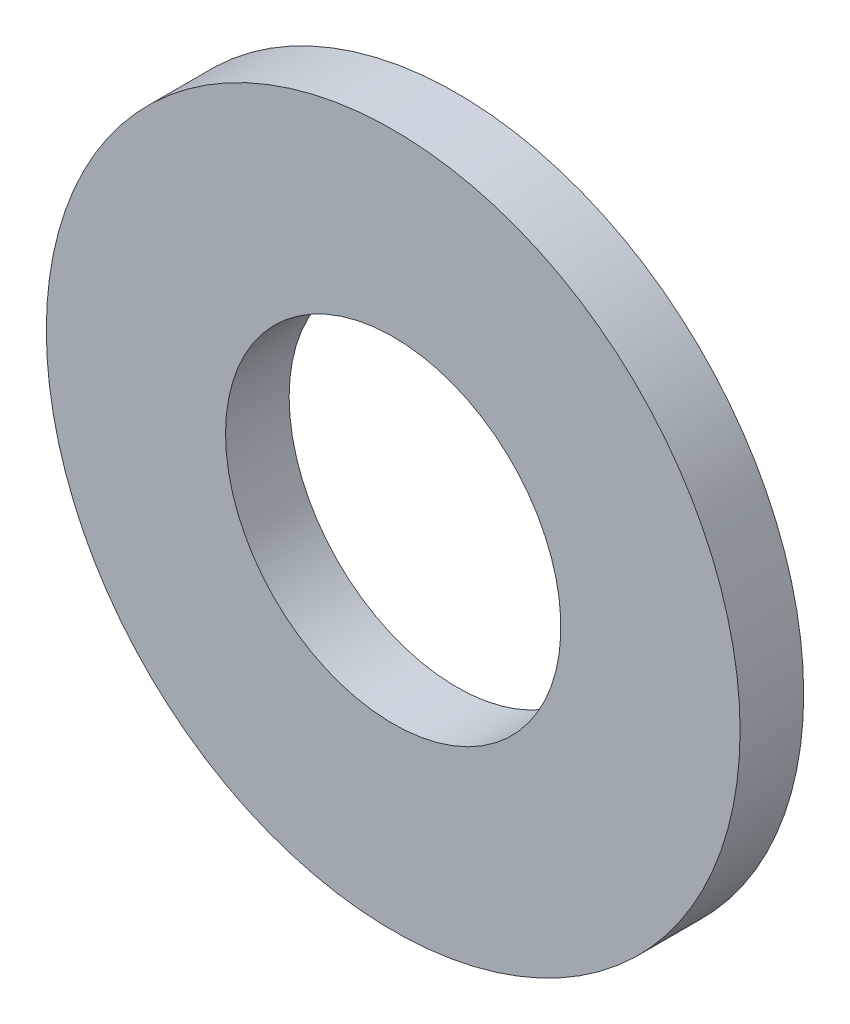
ISO-10303-21;
HEADER;
FILE_DESCRIPTION(('STEP AP214'),'2;1');
FILE_NAME('part.step','',(''),(''),'','','');
FILE_SCHEMA(('AUTOMOTIVE_DESIGN { 1 0 10303 214 1 1 1 1 }'));
ENDSEC;
DATA;
#1=APPLICATION_CONTEXT('core data for automotive mechanical design processes');
#2=APPLICATION_PROTOCOL_DEFINITION('international standard','automotive_design',2000,#1);
#3=PRODUCT_CONTEXT('',#1,'mechanical');
#4=PRODUCT('Part','Part','',(#3));
#5=PRODUCT_RELATED_PRODUCT_CATEGORY('part','',(#4));
#6=PRODUCT_DEFINITION_FORMATION('','',#4);
#7=PRODUCT_DEFINITION_CONTEXT('part definition',#1,'design');
#8=PRODUCT_DEFINITION('design','',#6,#7);
#9=PRODUCT_DEFINITION_SHAPE('','',#8);
#10=(LENGTH_UNIT() NAMED_UNIT(*) SI_UNIT(.MILLI.,.METRE.));
#11=(NAMED_UNIT(*) PLANE_ANGLE_UNIT() SI_UNIT($,.RADIAN.));
#12=(NAMED_UNIT(*) SI_UNIT($,.STERADIAN.) SOLID_ANGLE_UNIT());
#13=UNCERTAINTY_MEASURE_WITH_UNIT(LENGTH_MEASURE(1.E-05),#10,'distance_accuracy_value','');
#14=(GEOMETRIC_REPRESENTATION_CONTEXT(3) GLOBAL_UNCERTAINTY_ASSIGNED_CONTEXT((#13)) GLOBAL_UNIT_ASSIGNED_CONTEXT((#10,
#11,#12)) REPRESENTATION_CONTEXT('',''));
#15=CARTESIAN_POINT('',(0.,0.,0.));
#16=DIRECTION('',(0.,0.,1.));
#17=DIRECTION('',(1.,0.,0.));
#18=AXIS2_PLACEMENT_3D('',#15,#16,#17);
#19=CARTESIAN_POINT('',(0.,0.,0.275000000000001));
#20=DIRECTION('',(0.,0.,1.));
#21=DIRECTION('',(1.,0.,0.));
#22=AXIS2_PLACEMENT_3D('',#19,#20,#21);
#23=PLANE('',#22);
#24=CARTESIAN_POINT('',(0.,0.,0.275000000000001));
#25=DIRECTION('',(0.,0.,1.));
#26=DIRECTION('',(1.,0.,0.));
#27=AXIS2_PLACEMENT_3D('',#24,#25,#26);
#28=CIRCLE('',#27,3.);
#29=CARTESIAN_POINT('',(-3.,0.,0.275000000000001));
#30=VERTEX_POINT('',#29);
#31=EDGE_CURVE('E10',#30,#30,#28,.T.);
#32=ORIENTED_EDGE('',*,*,#31,.T.);
#33=EDGE_LOOP('',(#32));
#34=FACE_BOUND('',#33,.T.);
#35=CARTESIAN_POINT('',(0.,0.,0.275000000000001));
#36=DIRECTION('',(0.,0.,1.));
#37=DIRECTION('',(1.,0.,0.));
#38=AXIS2_PLACEMENT_3D('',#35,#36,#37);
#39=CIRCLE('',#38,1.45);
#40=CARTESIAN_POINT('',(-1.45,0.,0.275000000000001));
#41=VERTEX_POINT('',#40);
#42=EDGE_CURVE('E46',#41,#41,#39,.T.);
#43=ORIENTED_EDGE('',*,*,#42,.F.);
#44=EDGE_LOOP('',(#43));
#45=FACE_BOUND('',#44,.T.);
#46=ADVANCED_FACE('F38',(#34,#45),#23,.T.);
#47=CARTESIAN_POINT('',(0.,0.,0.275000000000001));
#48=DIRECTION('',(0.,0.,-1.));
#49=DIRECTION('',(-1.,0.,0.));
#50=AXIS2_PLACEMENT_3D('',#47,#48,#49);
#51=CYLINDRICAL_SURFACE('',#50,3.);
#52=CARTESIAN_POINT('',(0.,0.,-0.274999999999999));
#53=DIRECTION('',(0.,0.,1.));
#54=DIRECTION('',(1.,0.,0.));
#55=AXIS2_PLACEMENT_3D('',#52,#53,#54);
#56=CIRCLE('',#55,3.);
#57=CARTESIAN_POINT('',(-3.,0.,-0.274999999999999));
#58=VERTEX_POINT('',#57);
#59=EDGE_CURVE('E52',#58,#58,#56,.T.);
#60=CARTESIAN_POINT('',(-3.,0.,0.275000000000001));
#61=CARTESIAN_POINT('',(-3.,0.,0.269270833333334));
#62=CARTESIAN_POINT('',(-3.,0.,0.263541666666667));
#63=CARTESIAN_POINT('',(-3.,0.,0.252083333333334));
#64=CARTESIAN_POINT('',(-3.,0.,0.246354166666667));
#65=CARTESIAN_POINT('',(-3.,0.,0.234895833333334));
#66=CARTESIAN_POINT('',(-3.,0.,0.229166666666667));
#67=CARTESIAN_POINT('',(-3.,0.,0.217708333333334));
#68=CARTESIAN_POINT('',(-3.,0.,0.211979166666667));
#69=CARTESIAN_POINT('',(-3.,0.,0.200520833333334));
#70=CARTESIAN_POINT('',(-3.,0.,0.194791666666667));
#71=CARTESIAN_POINT('',(-3.,0.,0.183333333333334));
#72=CARTESIAN_POINT('',(-3.,0.,0.177604166666667));
#73=CARTESIAN_POINT('',(-3.,0.,0.166145833333334));
#74=CARTESIAN_POINT('',(-3.,0.,0.160416666666667));
#75=CARTESIAN_POINT('',(-3.,0.,0.148958333333334));
#76=CARTESIAN_POINT('',(-3.,0.,0.143229166666667));
#77=CARTESIAN_POINT('',(-3.,0.,0.131770833333334));
#78=CARTESIAN_POINT('',(-3.,0.,0.126041666666667));
#79=CARTESIAN_POINT('',(-3.,0.,0.114583333333334));
#80=CARTESIAN_POINT('',(-3.,0.,0.108854166666667));
#81=CARTESIAN_POINT('',(-3.,0.,0.0973958333333338));
#82=CARTESIAN_POINT('',(-3.,0.,0.0916666666666672));
#83=CARTESIAN_POINT('',(-3.,0.,0.0802083333333338));
#84=CARTESIAN_POINT('',(-3.,0.,0.0744791666666672));
#85=CARTESIAN_POINT('',(-3.,0.,0.0630208333333338));
#86=CARTESIAN_POINT('',(-3.,0.,0.0572916666666672));
#87=CARTESIAN_POINT('',(-3.,0.,0.0458333333333338));
#88=CARTESIAN_POINT('',(-3.,0.,0.0401041666666672));
#89=CARTESIAN_POINT('',(-3.,0.,0.0286458333333338));
#90=CARTESIAN_POINT('',(-3.,0.,0.0229166666666672));
#91=CARTESIAN_POINT('',(-3.,0.,0.0114583333333338));
#92=CARTESIAN_POINT('',(-3.,0.,0.00572916666666716));
#93=CARTESIAN_POINT('',(-3.,0.,-0.00572916666666618));
#94=CARTESIAN_POINT('',(-3.,0.,-0.0114583333333328));
#95=CARTESIAN_POINT('',(-3.,0.,-0.0229166666666662));
#96=CARTESIAN_POINT('',(-3.,0.,-0.0286458333333329));
#97=CARTESIAN_POINT('',(-3.,0.,-0.0401041666666662));
#98=CARTESIAN_POINT('',(-3.,0.,-0.0458333333333329));
#99=CARTESIAN_POINT('',(-3.,0.,-0.0572916666666662));
#100=CARTESIAN_POINT('',(-3.,0.,-0.0630208333333329));
#101=CARTESIAN_POINT('',(-3.,0.,-0.0744791666666662));
#102=CARTESIAN_POINT('',(-3.,0.,-0.0802083333333329));
#103=CARTESIAN_POINT('',(-3.,0.,-0.0916666666666662));
#104=CARTESIAN_POINT('',(-3.,0.,-0.0973958333333329));
#105=CARTESIAN_POINT('',(-3.,0.,-0.108854166666666));
#106=CARTESIAN_POINT('',(-3.,0.,-0.114583333333333));
#107=CARTESIAN_POINT('',(-3.,0.,-0.126041666666666));
#108=CARTESIAN_POINT('',(-3.,0.,-0.131770833333333));
#109=CARTESIAN_POINT('',(-3.,0.,-0.143229166666666));
#110=CARTESIAN_POINT('',(-3.,0.,-0.148958333333333));
#111=CARTESIAN_POINT('',(-3.,0.,-0.160416666666666));
#112=CARTESIAN_POINT('',(-3.,0.,-0.166145833333333));
#113=CARTESIAN_POINT('',(-3.,0.,-0.177604166666666));
#114=CARTESIAN_POINT('',(-3.,0.,-0.183333333333333));
#115=CARTESIAN_POINT('',(-3.,0.,-0.194791666666666));
#116=CARTESIAN_POINT('',(-3.,0.,-0.200520833333333));
#117=CARTESIAN_POINT('',(-3.,0.,-0.211979166666666));
#118=CARTESIAN_POINT('',(-3.,0.,-0.217708333333333));
#119=CARTESIAN_POINT('',(-3.,0.,-0.229166666666666));
#120=CARTESIAN_POINT('',(-3.,0.,-0.234895833333333));
#121=CARTESIAN_POINT('',(-3.,0.,-0.246354166666666));
#122=CARTESIAN_POINT('',(-3.,0.,-0.252083333333333));
#123=CARTESIAN_POINT('',(-3.,0.,-0.263541666666666));
#124=CARTESIAN_POINT('',(-3.,0.,-0.269270833333333));
#125=CARTESIAN_POINT('',(-3.,0.,-0.274999999999999));
#126=B_SPLINE_CURVE_WITH_KNOTS('',3,(#60,#61,#62,#63,#64,#65,#66,#67,#68,#69,#70,#71,#72,#73,
#74,#75,#76,#77,#78,#79,#80,#81,#82,#83,#84,#85,#86,#87,#88,#89,#90,#91,#92,#93,#94,#95,#96,#97,
#98,#99,#100,#101,#102,#103,#104,#105,#106,#107,#108,#109,#110,#111,#112,#113,#114,#115,#116,
#117,#118,#119,#120,#121,#122,#123,#124,#125),.UNSPECIFIED.,.F.,.F.,(4,2,2,2,2,2,2,2,2,2,2,2,2,
2,2,2,2,2,2,2,2,2,2,2,2,2,2,2,2,2,2,2,4),(0.,0.0171874999999999,0.034375,0.0515625,0.06875,
0.0859375,0.103125,0.1203125,0.1375,0.1546875,0.171875,0.1890625,0.20625,0.2234375,0.240625,
0.2578125,0.275,0.2921875,0.309375,0.3265625,0.34375,0.3609375,0.378125,0.3953125,0.4125,
0.4296875,0.446875,0.4640625,0.48125,0.4984375,0.515625,0.5328125,0.55),.UNSPECIFIED.);
#127=EDGE_CURVE('BSEAM40',#30,#58,#126,.T.);
#128=ORIENTED_EDGE('',*,*,#31,.F.);
#129=ORIENTED_EDGE('',*,*,#59,.T.);
#130=ORIENTED_EDGE('',*,*,#127,.T.);
#131=ORIENTED_EDGE('',*,*,#127,.F.);
#132=EDGE_LOOP('',(#128,#130,#129,#131));
#133=FACE_BOUND('',#132,.T.);
#134=ADVANCED_FACE('F40',(#133),#51,.T.);
#135=CARTESIAN_POINT('',(0.,0.,0.275000000000001));
#136=DIRECTION('',(0.,0.,-1.));
#137=DIRECTION('',(-1.,0.,0.));
#138=AXIS2_PLACEMENT_3D('',#135,#136,#137);
#139=CYLINDRICAL_SURFACE('',#138,1.45);
#140=CARTESIAN_POINT('',(0.,0.,-0.274999999999999));
#141=DIRECTION('',(0.,0.,1.));
#142=DIRECTION('',(1.,0.,0.));
#143=AXIS2_PLACEMENT_3D('',#140,#141,#142);
#144=CIRCLE('',#143,1.45);
#145=CARTESIAN_POINT('',(-1.45,0.,-0.274999999999999));
#146=VERTEX_POINT('',#145);
#147=EDGE_CURVE('E58',#146,#146,#144,.T.);
#148=CARTESIAN_POINT('',(-1.45,0.,0.275000000000001));
#149=CARTESIAN_POINT('',(-1.45,0.,0.269270833333334));
#150=CARTESIAN_POINT('',(-1.45,0.,0.263541666666667));
#151=CARTESIAN_POINT('',(-1.45,0.,0.252083333333334));
#152=CARTESIAN_POINT('',(-1.45,0.,0.246354166666667));
#153=CARTESIAN_POINT('',(-1.45,0.,0.234895833333334));
#154=CARTESIAN_POINT('',(-1.45,0.,0.229166666666667));
#155=CARTESIAN_POINT('',(-1.45,0.,0.217708333333334));
#156=CARTESIAN_POINT('',(-1.45,0.,0.211979166666667));
#157=CARTESIAN_POINT('',(-1.45,0.,0.200520833333334));
#158=CARTESIAN_POINT('',(-1.45,0.,0.194791666666667));
#159=CARTESIAN_POINT('',(-1.45,0.,0.183333333333334));
#160=CARTESIAN_POINT('',(-1.45,0.,0.177604166666667));
#161=CARTESIAN_POINT('',(-1.45,0.,0.166145833333334));
#162=CARTESIAN_POINT('',(-1.45,0.,0.160416666666667));
#163=CARTESIAN_POINT('',(-1.45,0.,0.148958333333334));
#164=CARTESIAN_POINT('',(-1.45,0.,0.143229166666667));
#165=CARTESIAN_POINT('',(-1.45,0.,0.131770833333334));
#166=CARTESIAN_POINT('',(-1.45,0.,0.126041666666667));
#167=CARTESIAN_POINT('',(-1.45,0.,0.114583333333334));
#168=CARTESIAN_POINT('',(-1.45,0.,0.108854166666667));
#169=CARTESIAN_POINT('',(-1.45,0.,0.0973958333333338));
#170=CARTESIAN_POINT('',(-1.45,0.,0.0916666666666672));
#171=CARTESIAN_POINT('',(-1.45,0.,0.0802083333333338));
#172=CARTESIAN_POINT('',(-1.45,0.,0.0744791666666672));
#173=CARTESIAN_POINT('',(-1.45,0.,0.0630208333333338));
#174=CARTESIAN_POINT('',(-1.45,0.,0.0572916666666672));
#175=CARTESIAN_POINT('',(-1.45,0.,0.0458333333333338));
#176=CARTESIAN_POINT('',(-1.45,0.,0.0401041666666672));
#177=CARTESIAN_POINT('',(-1.45,0.,0.0286458333333338));
#178=CARTESIAN_POINT('',(-1.45,0.,0.0229166666666672));
#179=CARTESIAN_POINT('',(-1.45,0.,0.0114583333333339));
#180=CARTESIAN_POINT('',(-1.45,0.,0.00572916666666721));
#181=CARTESIAN_POINT('',(-1.45,0.,-0.00572916666666613));
#182=CARTESIAN_POINT('',(-1.45,0.,-0.0114583333333328));
#183=CARTESIAN_POINT('',(-1.45,0.,-0.0229166666666661));
#184=CARTESIAN_POINT('',(-1.45,0.,-0.0286458333333328));
#185=CARTESIAN_POINT('',(-1.45,0.,-0.0401041666666661));
#186=CARTESIAN_POINT('',(-1.45,0.,-0.0458333333333328));
#187=CARTESIAN_POINT('',(-1.45,0.,-0.0572916666666661));
#188=CARTESIAN_POINT('',(-1.45,0.,-0.0630208333333328));
#189=CARTESIAN_POINT('',(-1.45,0.,-0.0744791666666662));
#190=CARTESIAN_POINT('',(-1.45,0.,-0.0802083333333328));
#191=CARTESIAN_POINT('',(-1.45,0.,-0.0916666666666661));
#192=CARTESIAN_POINT('',(-1.45,0.,-0.0973958333333328));
#193=CARTESIAN_POINT('',(-1.45,0.,-0.108854166666666));
#194=CARTESIAN_POINT('',(-1.45,0.,-0.114583333333333));
#195=CARTESIAN_POINT('',(-1.45,0.,-0.126041666666666));
#196=CARTESIAN_POINT('',(-1.45,0.,-0.131770833333333));
#197=CARTESIAN_POINT('',(-1.45,0.,-0.143229166666666));
#198=CARTESIAN_POINT('',(-1.45,0.,-0.148958333333333));
#199=CARTESIAN_POINT('',(-1.45,0.,-0.160416666666666));
#200=CARTESIAN_POINT('',(-1.45,0.,-0.166145833333333));
#201=CARTESIAN_POINT('',(-1.45,0.,-0.177604166666666));
#202=CARTESIAN_POINT('',(-1.45,0.,-0.183333333333333));
#203=CARTESIAN_POINT('',(-1.45,0.,-0.194791666666666));
#204=CARTESIAN_POINT('',(-1.45,0.,-0.200520833333333));
#205=CARTESIAN_POINT('',(-1.45,0.,-0.211979166666666));
#206=CARTESIAN_POINT('',(-1.45,0.,-0.217708333333333));
#207=CARTESIAN_POINT('',(-1.45,0.,-0.229166666666666));
#208=CARTESIAN_POINT('',(-1.45,0.,-0.234895833333333));
#209=CARTESIAN_POINT('',(-1.45,0.,-0.246354166666666));
#210=CARTESIAN_POINT('',(-1.45,0.,-0.252083333333333));
#211=CARTESIAN_POINT('',(-1.45,0.,-0.263541666666666));
#212=CARTESIAN_POINT('',(-1.45,0.,-0.269270833333333));
#213=CARTESIAN_POINT('',(-1.45,0.,-0.274999999999999));
#214=B_SPLINE_CURVE_WITH_KNOTS('',3,(#148,#149,#150,#151,#152,#153,#154,#155,#156,#157,#158,
#159,#160,#161,#162,#163,#164,#165,#166,#167,#168,#169,#170,#171,#172,#173,#174,#175,#176,#177,
#178,#179,#180,#181,#182,#183,#184,#185,#186,#187,#188,#189,#190,#191,#192,#193,#194,#195,#196,
#197,#198,#199,#200,#201,#202,#203,#204,#205,#206,#207,#208,#209,#210,#211,#212,#213),
.UNSPECIFIED.,.F.,.F.,(4,2,2,2,2,2,2,2,2,2,2,2,2,2,2,2,2,2,2,2,2,2,2,2,2,2,2,2,2,2,2,2,4),(0.,
0.0171875,0.034375,0.0515625,0.06875,0.0859375,0.103125,0.1203125,0.1375,0.1546875,0.171875,
0.1890625,0.20625,0.2234375,0.240625,0.2578125,0.275,0.2921875,0.309375,0.3265625,0.34375,
0.3609375,0.378125,0.3953125,0.4125,0.4296875,0.446875,0.4640625,0.48125,0.4984375,0.515625,
0.5328125,0.55),.UNSPECIFIED.);
#215=EDGE_CURVE('BSEAM69',#41,#146,#214,.T.);
#216=ORIENTED_EDGE('',*,*,#42,.T.);
#217=ORIENTED_EDGE('',*,*,#147,.F.);
#218=ORIENTED_EDGE('',*,*,#215,.T.);
#219=ORIENTED_EDGE('',*,*,#215,.F.);
#220=EDGE_LOOP('',(#216,#218,#217,#219));
#221=FACE_BOUND('',#220,.T.);
#222=ADVANCED_FACE('F69',(#221),#139,.F.);
#223=CARTESIAN_POINT('',(0.,0.,-0.274999999999999));
#224=DIRECTION('',(0.,0.,1.));
#225=DIRECTION('',(1.,0.,0.));
#226=AXIS2_PLACEMENT_3D('',#223,#224,#225);
#227=PLANE('',#226);
#228=ORIENTED_EDGE('',*,*,#147,.T.);
#229=EDGE_LOOP('',(#228));
#230=FACE_BOUND('',#229,.T.);
#231=ORIENTED_EDGE('',*,*,#59,.F.);
#232=EDGE_LOOP('',(#231));
#233=FACE_BOUND('',#232,.T.);
#234=ADVANCED_FACE('F66',(#230,#233),#227,.F.);
#235=CLOSED_SHELL('',(#46,#134,#222,#234));
#236=MANIFOLD_SOLID_BREP('B2',#235);
#237=ADVANCED_BREP_SHAPE_REPRESENTATION('',(#18,#236),#14);
#238=SHAPE_DEFINITION_REPRESENTATION(#9,#237);
ENDSEC;
END-ISO-10303-21;
